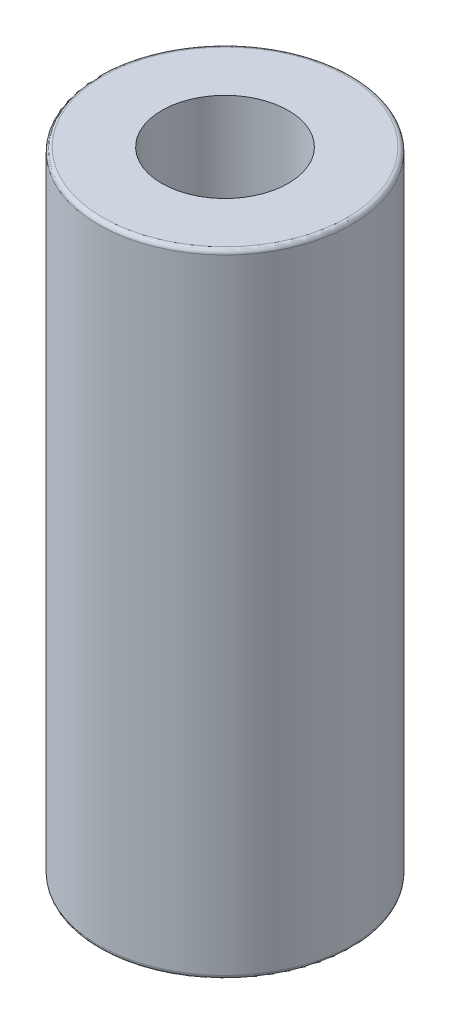
ISO-10303-21;
HEADER;
FILE_DESCRIPTION(('STEP AP214'),'2;1');
FILE_NAME('part.step','',(''),(''),'','','');
FILE_SCHEMA(('AUTOMOTIVE_DESIGN { 1 0 10303 214 1 1 1 1 }'));
ENDSEC;
DATA;
#1=APPLICATION_CONTEXT('core data for automotive mechanical design processes');
#2=APPLICATION_PROTOCOL_DEFINITION('international standard','automotive_design',2000,#1);
#3=PRODUCT_CONTEXT('',#1,'mechanical');
#4=PRODUCT('Part','Part','',(#3));
#5=PRODUCT_RELATED_PRODUCT_CATEGORY('part','',(#4));
#6=PRODUCT_DEFINITION_FORMATION('','',#4);
#7=PRODUCT_DEFINITION_CONTEXT('part definition',#1,'design');
#8=PRODUCT_DEFINITION('design','',#6,#7);
#9=PRODUCT_DEFINITION_SHAPE('','',#8);
#10=(LENGTH_UNIT() NAMED_UNIT(*) SI_UNIT(.MILLI.,.METRE.));
#11=(NAMED_UNIT(*) PLANE_ANGLE_UNIT() SI_UNIT($,.RADIAN.));
#12=(NAMED_UNIT(*) SI_UNIT($,.STERADIAN.) SOLID_ANGLE_UNIT());
#13=UNCERTAINTY_MEASURE_WITH_UNIT(LENGTH_MEASURE(1.E-05),#10,'distance_accuracy_value','');
#14=(GEOMETRIC_REPRESENTATION_CONTEXT(3) GLOBAL_UNCERTAINTY_ASSIGNED_CONTEXT((#13)) GLOBAL_UNIT_ASSIGNED_CONTEXT((#10,
#11,#12)) REPRESENTATION_CONTEXT('',''));
#15=CARTESIAN_POINT('',(0.,0.,0.));
#16=DIRECTION('',(0.,0.,1.));
#17=DIRECTION('',(1.,0.,0.));
#18=AXIS2_PLACEMENT_3D('',#15,#16,#17);
#19=CARTESIAN_POINT('',(0.,15.,0.));
#20=DIRECTION('',(0.,1.,0.));
#21=DIRECTION('',(0.,0.,1.));
#22=AXIS2_PLACEMENT_3D('',#19,#20,#21);
#23=PLANE('',#22);
#24=CARTESIAN_POINT('',(0.,15.,0.));
#25=DIRECTION('',(0.,1.,0.));
#26=DIRECTION('',(0.,0.,1.));
#27=AXIS2_PLACEMENT_3D('',#24,#25,#26);
#28=CIRCLE('',#27,2.9);
#29=CARTESIAN_POINT('',(0.,15.,2.9));
#30=VERTEX_POINT('',#29);
#31=EDGE_CURVE('E10',#30,#30,#28,.T.);
#32=ORIENTED_EDGE('',*,*,#31,.T.);
#33=EDGE_LOOP('',(#32));
#34=FACE_BOUND('',#33,.T.);
#35=CARTESIAN_POINT('',(0.,15.,0.));
#36=DIRECTION('',(0.,1.,0.));
#37=DIRECTION('',(0.,0.,1.));
#38=AXIS2_PLACEMENT_3D('',#35,#36,#37);
#39=CIRCLE('',#38,1.5);
#40=CARTESIAN_POINT('',(0.,15.,1.5));
#41=VERTEX_POINT('',#40);
#42=EDGE_CURVE('E51',#41,#41,#39,.T.);
#43=ORIENTED_EDGE('',*,*,#42,.F.);
#44=EDGE_LOOP('',(#43));
#45=FACE_BOUND('',#44,.T.);
#46=ADVANCED_FACE('F31',(#34,#45),#23,.T.);
#47=CARTESIAN_POINT('',(0.,0.,0.));
#48=DIRECTION('',(0.,1.,0.));
#49=DIRECTION('',(0.,0.,1.));
#50=AXIS2_PLACEMENT_3D('',#47,#48,#49);
#51=PLANE('',#50);
#52=CARTESIAN_POINT('',(0.,0.,0.));
#53=DIRECTION('',(0.,1.,0.));
#54=DIRECTION('',(0.,0.,1.));
#55=AXIS2_PLACEMENT_3D('',#52,#53,#54);
#56=CIRCLE('',#55,2.9);
#57=CARTESIAN_POINT('',(0.,0.,2.9));
#58=VERTEX_POINT('',#57);
#59=EDGE_CURVE('E38',#58,#58,#56,.F.);
#60=ORIENTED_EDGE('',*,*,#59,.T.);
#61=EDGE_LOOP('',(#60));
#62=FACE_BOUND('',#61,.T.);
#63=CARTESIAN_POINT('',(0.,0.,0.));
#64=DIRECTION('',(0.,1.,0.));
#65=DIRECTION('',(0.,0.,1.));
#66=AXIS2_PLACEMENT_3D('',#63,#64,#65);
#67=CIRCLE('',#66,1.5);
#68=CARTESIAN_POINT('',(0.,0.,1.5));
#69=VERTEX_POINT('',#68);
#70=EDGE_CURVE('E52',#69,#69,#67,.T.);
#71=ORIENTED_EDGE('',*,*,#70,.T.);
#72=EDGE_LOOP('',(#71));
#73=FACE_BOUND('',#72,.T.);
#74=ADVANCED_FACE('F62',(#62,#73),#51,.F.);
#75=CARTESIAN_POINT('',(0.,15.,0.));
#76=DIRECTION('',(0.,-1.,0.));
#77=DIRECTION('',(0.,0.,-1.));
#78=AXIS2_PLACEMENT_3D('',#75,#76,#77);
#79=CYLINDRICAL_SURFACE('',#78,3.);
#80=CARTESIAN_POINT('',(0.,0.0999999999999994,0.));
#81=DIRECTION('',(0.,1.,0.));
#82=DIRECTION('',(0.,0.,1.));
#83=AXIS2_PLACEMENT_3D('',#80,#81,#82);
#84=CIRCLE('',#83,3.);
#85=CARTESIAN_POINT('',(0.,0.0999999999999994,3.));
#86=VERTEX_POINT('',#85);
#87=EDGE_CURVE('E42',#86,#86,#84,.T.);
#88=ORIENTED_EDGE('',*,*,#87,.T.);
#89=EDGE_LOOP('',(#88));
#90=FACE_BOUND('',#89,.T.);
#91=CARTESIAN_POINT('',(0.,14.9,0.));
#92=DIRECTION('',(0.,1.,0.));
#93=DIRECTION('',(0.,0.,1.));
#94=AXIS2_PLACEMENT_3D('',#91,#92,#93);
#95=CIRCLE('',#94,3.);
#96=CARTESIAN_POINT('',(0.,14.9,3.));
#97=VERTEX_POINT('',#96);
#98=EDGE_CURVE('E46',#97,#97,#95,.F.);
#99=ORIENTED_EDGE('',*,*,#98,.T.);
#100=EDGE_LOOP('',(#99));
#101=FACE_BOUND('',#100,.T.);
#102=ADVANCED_FACE('F67',(#90,#101),#79,.T.);
#103=CARTESIAN_POINT('',(0.,15.,0.));
#104=DIRECTION('',(0.,-1.,0.));
#105=DIRECTION('',(0.,0.,-1.));
#106=AXIS2_PLACEMENT_3D('',#103,#104,#105);
#107=CYLINDRICAL_SURFACE('',#106,1.5);
#108=ORIENTED_EDGE('',*,*,#42,.T.);
#109=EDGE_LOOP('',(#108));
#110=FACE_BOUND('',#109,.T.);
#111=ORIENTED_EDGE('',*,*,#70,.F.);
#112=EDGE_LOOP('',(#111));
#113=FACE_BOUND('',#112,.T.);
#114=ADVANCED_FACE('F58',(#110,#113),#107,.F.);
#115=CARTESIAN_POINT('',(0.,0.0999999999999994,0.));
#116=DIRECTION('',(0.,1.,0.));
#117=DIRECTION('',(0.,0.,1.));
#118=AXIS2_PLACEMENT_3D('',#115,#116,#117);
#119=TOROIDAL_SURFACE('',#118,2.9,0.1);
#120=ORIENTED_EDGE('',*,*,#59,.F.);
#121=EDGE_LOOP('',(#120));
#122=FACE_BOUND('',#121,.T.);
#123=ORIENTED_EDGE('',*,*,#87,.F.);
#124=EDGE_LOOP('',(#123));
#125=FACE_BOUND('',#124,.T.);
#126=ADVANCED_FACE('F73',(#122,#125),#119,.T.);
#127=CARTESIAN_POINT('',(0.,14.9,0.));
#128=DIRECTION('',(0.,1.,0.));
#129=DIRECTION('',(0.,0.,1.));
#130=AXIS2_PLACEMENT_3D('',#127,#128,#129);
#131=TOROIDAL_SURFACE('',#130,2.9,0.1);
#132=ORIENTED_EDGE('',*,*,#98,.F.);
#133=EDGE_LOOP('',(#132));
#134=FACE_BOUND('',#133,.T.);
#135=ORIENTED_EDGE('',*,*,#31,.F.);
#136=EDGE_LOOP('',(#135));
#137=FACE_BOUND('',#136,.T.);
#138=ADVANCED_FACE('F33',(#134,#137),#131,.T.);
#139=CLOSED_SHELL('',(#46,#74,#102,#114,#126,#138));
#140=MANIFOLD_SOLID_BREP('B2',#139);
#141=ADVANCED_BREP_SHAPE_REPRESENTATION('',(#18,#140),#14);
#142=SHAPE_DEFINITION_REPRESENTATION(#9,#141);
ENDSEC;
END-ISO-10303-21;
